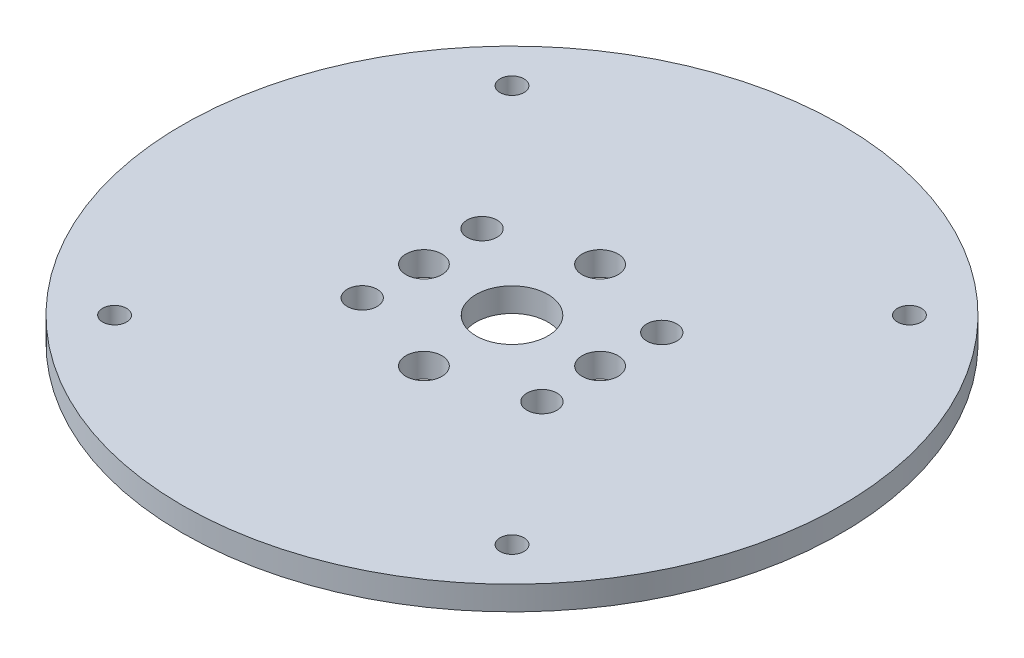
ISO-10303-21;
HEADER;
FILE_DESCRIPTION(('STEP AP214'),'2;1');
FILE_NAME('part.step','',(''),(''),'','','');
FILE_SCHEMA(('AUTOMOTIVE_DESIGN { 1 0 10303 214 1 1 1 1 }'));
ENDSEC;
DATA;
#1=APPLICATION_CONTEXT('core data for automotive mechanical design processes');
#2=APPLICATION_PROTOCOL_DEFINITION('international standard','automotive_design',2000,#1);
#3=PRODUCT_CONTEXT('',#1,'mechanical');
#4=PRODUCT('Part','Part','',(#3));
#5=PRODUCT_RELATED_PRODUCT_CATEGORY('part','',(#4));
#6=PRODUCT_DEFINITION_FORMATION('','',#4);
#7=PRODUCT_DEFINITION_CONTEXT('part definition',#1,'design');
#8=PRODUCT_DEFINITION('design','',#6,#7);
#9=PRODUCT_DEFINITION_SHAPE('','',#8);
#10=(LENGTH_UNIT() NAMED_UNIT(*) SI_UNIT(.MILLI.,.METRE.));
#11=(NAMED_UNIT(*) PLANE_ANGLE_UNIT() SI_UNIT($,.RADIAN.));
#12=(NAMED_UNIT(*) SI_UNIT($,.STERADIAN.) SOLID_ANGLE_UNIT());
#13=UNCERTAINTY_MEASURE_WITH_UNIT(LENGTH_MEASURE(1.E-05),#10,'distance_accuracy_value','');
#14=(GEOMETRIC_REPRESENTATION_CONTEXT(3) GLOBAL_UNCERTAINTY_ASSIGNED_CONTEXT((#13)) GLOBAL_UNIT_ASSIGNED_CONTEXT((#10,
#11,#12)) REPRESENTATION_CONTEXT('',''));
#15=CARTESIAN_POINT('',(0.,0.,0.));
#16=DIRECTION('',(0.,0.,1.));
#17=DIRECTION('',(1.,0.,0.));
#18=AXIS2_PLACEMENT_3D('',#15,#16,#17);
#19=CARTESIAN_POINT('',(1.14843970519052,2.,-1.09285714285713));
#20=DIRECTION('',(0.,1.,0.));
#21=DIRECTION('',(0.,0.,1.));
#22=AXIS2_PLACEMENT_3D('',#19,#20,#21);
#23=PLANE('',#22);
#24=CARTESIAN_POINT('',(17.7299397051905,2.,15.4886428571429));
#25=DIRECTION('',(0.,1.,0.));
#26=DIRECTION('',(0.,0.,1.));
#27=AXIS2_PLACEMENT_3D('',#24,#25,#26);
#28=CIRCLE('',#27,1.);
#29=CARTESIAN_POINT('',(17.7299397051905,2.,16.4886428571429));
#30=VERTEX_POINT('',#29);
#31=EDGE_CURVE('E106',#30,#30,#28,.T.);
#32=ORIENTED_EDGE('',*,*,#31,.F.);
#33=EDGE_LOOP('',(#32));
#34=FACE_BOUND('',#33,.T.);
#35=CARTESIAN_POINT('',(-15.4330602948095,2.,-17.6743571428571));
#36=DIRECTION('',(0.,1.,0.));
#37=DIRECTION('',(0.,0.,1.));
#38=AXIS2_PLACEMENT_3D('',#35,#36,#37);
#39=CIRCLE('',#38,1.);
#40=CARTESIAN_POINT('',(-15.4330602948095,2.,-16.6743571428571));
#41=VERTEX_POINT('',#40);
#42=EDGE_CURVE('E94',#41,#41,#39,.T.);
#43=ORIENTED_EDGE('',*,*,#42,.F.);
#44=EDGE_LOOP('',(#43));
#45=FACE_BOUND('',#44,.T.);
#46=CARTESIAN_POINT('',(8.64843970519052,2.,3.90714285714287));
#47=DIRECTION('',(0.,1.,0.));
#48=DIRECTION('',(0.,0.,1.));
#49=AXIS2_PLACEMENT_3D('',#46,#47,#48);
#50=CIRCLE('',#49,1.25);
#51=CARTESIAN_POINT('',(8.64843970519052,2.,5.15714285714287));
#52=VERTEX_POINT('',#51);
#53=EDGE_CURVE('E82',#52,#52,#50,.T.);
#54=ORIENTED_EDGE('',*,*,#53,.F.);
#55=EDGE_LOOP('',(#54));
#56=FACE_BOUND('',#55,.T.);
#57=CARTESIAN_POINT('',(-6.35156029480948,2.,-6.09285714285713));
#58=DIRECTION('',(0.,1.,0.));
#59=DIRECTION('',(0.,0.,1.));
#60=AXIS2_PLACEMENT_3D('',#57,#58,#59);
#61=CIRCLE('',#60,1.25);
#62=CARTESIAN_POINT('',(-6.35156029480948,2.,-4.84285714285713));
#63=VERTEX_POINT('',#62);
#64=EDGE_CURVE('E70',#63,#63,#61,.T.);
#65=ORIENTED_EDGE('',*,*,#64,.F.);
#66=EDGE_LOOP('',(#65));
#67=FACE_BOUND('',#66,.T.);
#68=CARTESIAN_POINT('',(8.49843970519052,2.,-1.09285714285708));
#69=DIRECTION('',(0.,1.,0.));
#70=DIRECTION('',(0.,0.,1.));
#71=AXIS2_PLACEMENT_3D('',#68,#69,#70);
#72=CIRCLE('',#71,1.5);
#73=CARTESIAN_POINT('',(8.49843970519052,2.,0.407142857142919));
#74=VERTEX_POINT('',#73);
#75=EDGE_CURVE('E58',#74,#74,#72,.T.);
#76=ORIENTED_EDGE('',*,*,#75,.F.);
#77=EDGE_LOOP('',(#76));
#78=FACE_BOUND('',#77,.T.);
#79=CARTESIAN_POINT('',(-6.20156029480948,2.,-1.09285714285713));
#80=DIRECTION('',(0.,1.,0.));
#81=DIRECTION('',(0.,0.,1.));
#82=AXIS2_PLACEMENT_3D('',#79,#80,#81);
#83=CIRCLE('',#82,1.5);
#84=CARTESIAN_POINT('',(-6.20156029480948,2.,0.407142857142868));
#85=VERTEX_POINT('',#84);
#86=EDGE_CURVE('E46',#85,#85,#83,.T.);
#87=ORIENTED_EDGE('',*,*,#86,.F.);
#88=EDGE_LOOP('',(#87));
#89=FACE_BOUND('',#88,.T.);
#90=CARTESIAN_POINT('',(1.14843970519052,2.,-1.09285714285713));
#91=DIRECTION('',(0.,1.,0.));
#92=DIRECTION('',(0.,0.,1.));
#93=AXIS2_PLACEMENT_3D('',#90,#91,#92);
#94=CIRCLE('',#93,27.5);
#95=CARTESIAN_POINT('',(1.14843970519052,2.,26.4071428571429));
#96=VERTEX_POINT('',#95);
#97=EDGE_CURVE('E10',#96,#96,#94,.T.);
#98=ORIENTED_EDGE('',*,*,#97,.T.);
#99=EDGE_LOOP('',(#98));
#100=FACE_BOUND('',#99,.T.);
#101=CARTESIAN_POINT('',(1.14843970519052,2.,-1.09285714285713));
#102=DIRECTION('',(0.,1.,0.));
#103=DIRECTION('',(0.,0.,1.));
#104=AXIS2_PLACEMENT_3D('',#101,#102,#103);
#105=CIRCLE('',#104,3.);
#106=CARTESIAN_POINT('',(1.14843970519052,2.,1.90714285714287));
#107=VERTEX_POINT('',#106);
#108=EDGE_CURVE('E41',#107,#107,#105,.T.);
#109=ORIENTED_EDGE('',*,*,#108,.F.);
#110=EDGE_LOOP('',(#109));
#111=FACE_BOUND('',#110,.T.);
#112=CARTESIAN_POINT('',(1.14843970519054,2.,-8.44285714285713));
#113=DIRECTION('',(0.,1.,0.));
#114=DIRECTION('',(0.,0.,1.));
#115=AXIS2_PLACEMENT_3D('',#112,#113,#114);
#116=CIRCLE('',#115,1.5);
#117=CARTESIAN_POINT('',(1.14843970519054,2.,-6.94285714285713));
#118=VERTEX_POINT('',#117);
#119=EDGE_CURVE('E52',#118,#118,#116,.T.);
#120=ORIENTED_EDGE('',*,*,#119,.F.);
#121=EDGE_LOOP('',(#120));
#122=FACE_BOUND('',#121,.T.);
#123=CARTESIAN_POINT('',(1.14843970519044,2.,6.25714285714287));
#124=DIRECTION('',(0.,1.,0.));
#125=DIRECTION('',(0.,0.,1.));
#126=AXIS2_PLACEMENT_3D('',#123,#124,#125);
#127=CIRCLE('',#126,1.5);
#128=CARTESIAN_POINT('',(1.14843970519044,2.,7.75714285714287));
#129=VERTEX_POINT('',#128);
#130=EDGE_CURVE('E64',#129,#129,#127,.T.);
#131=ORIENTED_EDGE('',*,*,#130,.F.);
#132=EDGE_LOOP('',(#131));
#133=FACE_BOUND('',#132,.T.);
#134=CARTESIAN_POINT('',(8.64843970519052,2.,-6.09285714285713));
#135=DIRECTION('',(0.,1.,0.));
#136=DIRECTION('',(0.,0.,1.));
#137=AXIS2_PLACEMENT_3D('',#134,#135,#136);
#138=CIRCLE('',#137,1.25);
#139=CARTESIAN_POINT('',(8.64843970519052,2.,-4.84285714285713));
#140=VERTEX_POINT('',#139);
#141=EDGE_CURVE('E76',#140,#140,#138,.T.);
#142=ORIENTED_EDGE('',*,*,#141,.F.);
#143=EDGE_LOOP('',(#142));
#144=FACE_BOUND('',#143,.T.);
#145=CARTESIAN_POINT('',(-6.35156029480948,2.,3.90714285714287));
#146=DIRECTION('',(0.,1.,0.));
#147=DIRECTION('',(0.,0.,1.));
#148=AXIS2_PLACEMENT_3D('',#145,#146,#147);
#149=CIRCLE('',#148,1.25);
#150=CARTESIAN_POINT('',(-6.35156029480948,2.,5.15714285714287));
#151=VERTEX_POINT('',#150);
#152=EDGE_CURVE('E88',#151,#151,#149,.T.);
#153=ORIENTED_EDGE('',*,*,#152,.F.);
#154=EDGE_LOOP('',(#153));
#155=FACE_BOUND('',#154,.T.);
#156=CARTESIAN_POINT('',(17.7299397051905,2.,-17.6743571428571));
#157=DIRECTION('',(0.,1.,0.));
#158=DIRECTION('',(0.,0.,1.));
#159=AXIS2_PLACEMENT_3D('',#156,#157,#158);
#160=CIRCLE('',#159,1.);
#161=CARTESIAN_POINT('',(17.7299397051905,2.,-16.6743571428571));
#162=VERTEX_POINT('',#161);
#163=EDGE_CURVE('E100',#162,#162,#160,.T.);
#164=ORIENTED_EDGE('',*,*,#163,.F.);
#165=EDGE_LOOP('',(#164));
#166=FACE_BOUND('',#165,.T.);
#167=CARTESIAN_POINT('',(-15.4330602948095,2.,15.4886428571429));
#168=DIRECTION('',(0.,1.,0.));
#169=DIRECTION('',(0.,0.,1.));
#170=AXIS2_PLACEMENT_3D('',#167,#168,#169);
#171=CIRCLE('',#170,1.);
#172=CARTESIAN_POINT('',(-15.4330602948095,2.,16.4886428571429));
#173=VERTEX_POINT('',#172);
#174=EDGE_CURVE('E112',#173,#173,#171,.T.);
#175=ORIENTED_EDGE('',*,*,#174,.F.);
#176=EDGE_LOOP('',(#175));
#177=FACE_BOUND('',#176,.T.);
#178=ADVANCED_FACE('F30',(#34,#45,#56,#67,#78,#89,#100,#111,#122,#133,#144,#155,#166,#177),#23,.T.);
#179=CARTESIAN_POINT('',(1.14843970519052,0.,-1.09285714285713));
#180=DIRECTION('',(0.,1.,0.));
#181=DIRECTION('',(0.,0.,1.));
#182=AXIS2_PLACEMENT_3D('',#179,#180,#181);
#183=PLANE('',#182);
#184=CARTESIAN_POINT('',(1.14843970519052,0.,-1.09285714285713));
#185=DIRECTION('',(0.,1.,0.));
#186=DIRECTION('',(0.,0.,1.));
#187=AXIS2_PLACEMENT_3D('',#184,#185,#186);
#188=CIRCLE('',#187,27.5);
#189=CARTESIAN_POINT('',(1.14843970519052,0.,26.4071428571429));
#190=VERTEX_POINT('',#189);
#191=EDGE_CURVE('E34',#190,#190,#188,.T.);
#192=ORIENTED_EDGE('',*,*,#191,.F.);
#193=EDGE_LOOP('',(#192));
#194=FACE_BOUND('',#193,.T.);
#195=CARTESIAN_POINT('',(1.14843970519052,0.,-1.09285714285713));
#196=DIRECTION('',(0.,1.,0.));
#197=DIRECTION('',(0.,0.,1.));
#198=AXIS2_PLACEMENT_3D('',#195,#196,#197);
#199=CIRCLE('',#198,3.);
#200=CARTESIAN_POINT('',(1.14843970519052,0.,1.90714285714287));
#201=VERTEX_POINT('',#200);
#202=EDGE_CURVE('E43',#201,#201,#199,.T.);
#203=ORIENTED_EDGE('',*,*,#202,.T.);
#204=EDGE_LOOP('',(#203));
#205=FACE_BOUND('',#204,.T.);
#206=CARTESIAN_POINT('',(-6.20156029480948,0.,-1.09285714285713));
#207=DIRECTION('',(0.,1.,0.));
#208=DIRECTION('',(0.,0.,1.));
#209=AXIS2_PLACEMENT_3D('',#206,#207,#208);
#210=CIRCLE('',#209,1.5);
#211=CARTESIAN_POINT('',(-6.20156029480948,0.,0.407142857142868));
#212=VERTEX_POINT('',#211);
#213=EDGE_CURVE('E49',#212,#212,#210,.T.);
#214=ORIENTED_EDGE('',*,*,#213,.T.);
#215=EDGE_LOOP('',(#214));
#216=FACE_BOUND('',#215,.T.);
#217=CARTESIAN_POINT('',(1.14843970519054,0.,-8.44285714285713));
#218=DIRECTION('',(0.,1.,0.));
#219=DIRECTION('',(0.,0.,1.));
#220=AXIS2_PLACEMENT_3D('',#217,#218,#219);
#221=CIRCLE('',#220,1.5);
#222=CARTESIAN_POINT('',(1.14843970519054,0.,-6.94285714285713));
#223=VERTEX_POINT('',#222);
#224=EDGE_CURVE('E55',#223,#223,#221,.T.);
#225=ORIENTED_EDGE('',*,*,#224,.T.);
#226=EDGE_LOOP('',(#225));
#227=FACE_BOUND('',#226,.T.);
#228=CARTESIAN_POINT('',(8.49843970519052,0.,-1.09285714285708));
#229=DIRECTION('',(0.,1.,0.));
#230=DIRECTION('',(0.,0.,1.));
#231=AXIS2_PLACEMENT_3D('',#228,#229,#230);
#232=CIRCLE('',#231,1.5);
#233=CARTESIAN_POINT('',(8.49843970519052,0.,0.407142857142919));
#234=VERTEX_POINT('',#233);
#235=EDGE_CURVE('E61',#234,#234,#232,.T.);
#236=ORIENTED_EDGE('',*,*,#235,.T.);
#237=EDGE_LOOP('',(#236));
#238=FACE_BOUND('',#237,.T.);
#239=CARTESIAN_POINT('',(1.14843970519044,0.,6.25714285714287));
#240=DIRECTION('',(0.,1.,0.));
#241=DIRECTION('',(0.,0.,1.));
#242=AXIS2_PLACEMENT_3D('',#239,#240,#241);
#243=CIRCLE('',#242,1.5);
#244=CARTESIAN_POINT('',(1.14843970519044,0.,7.75714285714287));
#245=VERTEX_POINT('',#244);
#246=EDGE_CURVE('E67',#245,#245,#243,.T.);
#247=ORIENTED_EDGE('',*,*,#246,.T.);
#248=EDGE_LOOP('',(#247));
#249=FACE_BOUND('',#248,.T.);
#250=CARTESIAN_POINT('',(-6.35156029480948,0.,-6.09285714285713));
#251=DIRECTION('',(0.,1.,0.));
#252=DIRECTION('',(0.,0.,1.));
#253=AXIS2_PLACEMENT_3D('',#250,#251,#252);
#254=CIRCLE('',#253,1.25);
#255=CARTESIAN_POINT('',(-6.35156029480948,0.,-4.84285714285713));
#256=VERTEX_POINT('',#255);
#257=EDGE_CURVE('E73',#256,#256,#254,.T.);
#258=ORIENTED_EDGE('',*,*,#257,.T.);
#259=EDGE_LOOP('',(#258));
#260=FACE_BOUND('',#259,.T.);
#261=CARTESIAN_POINT('',(8.64843970519052,0.,-6.09285714285713));
#262=DIRECTION('',(0.,1.,0.));
#263=DIRECTION('',(0.,0.,1.));
#264=AXIS2_PLACEMENT_3D('',#261,#262,#263);
#265=CIRCLE('',#264,1.25);
#266=CARTESIAN_POINT('',(8.64843970519052,0.,-4.84285714285713));
#267=VERTEX_POINT('',#266);
#268=EDGE_CURVE('E79',#267,#267,#265,.T.);
#269=ORIENTED_EDGE('',*,*,#268,.T.);
#270=EDGE_LOOP('',(#269));
#271=FACE_BOUND('',#270,.T.);
#272=CARTESIAN_POINT('',(8.64843970519052,0.,3.90714285714287));
#273=DIRECTION('',(0.,1.,0.));
#274=DIRECTION('',(0.,0.,1.));
#275=AXIS2_PLACEMENT_3D('',#272,#273,#274);
#276=CIRCLE('',#275,1.25);
#277=CARTESIAN_POINT('',(8.64843970519052,0.,5.15714285714287));
#278=VERTEX_POINT('',#277);
#279=EDGE_CURVE('E85',#278,#278,#276,.T.);
#280=ORIENTED_EDGE('',*,*,#279,.T.);
#281=EDGE_LOOP('',(#280));
#282=FACE_BOUND('',#281,.T.);
#283=CARTESIAN_POINT('',(-6.35156029480948,0.,3.90714285714287));
#284=DIRECTION('',(0.,1.,0.));
#285=DIRECTION('',(0.,0.,1.));
#286=AXIS2_PLACEMENT_3D('',#283,#284,#285);
#287=CIRCLE('',#286,1.25);
#288=CARTESIAN_POINT('',(-6.35156029480948,0.,5.15714285714287));
#289=VERTEX_POINT('',#288);
#290=EDGE_CURVE('E91',#289,#289,#287,.T.);
#291=ORIENTED_EDGE('',*,*,#290,.T.);
#292=EDGE_LOOP('',(#291));
#293=FACE_BOUND('',#292,.T.);
#294=CARTESIAN_POINT('',(-15.4330602948095,0.,-17.6743571428571));
#295=DIRECTION('',(0.,1.,0.));
#296=DIRECTION('',(0.,0.,1.));
#297=AXIS2_PLACEMENT_3D('',#294,#295,#296);
#298=CIRCLE('',#297,1.);
#299=CARTESIAN_POINT('',(-15.4330602948095,0.,-16.6743571428571));
#300=VERTEX_POINT('',#299);
#301=EDGE_CURVE('E97',#300,#300,#298,.T.);
#302=ORIENTED_EDGE('',*,*,#301,.T.);
#303=EDGE_LOOP('',(#302));
#304=FACE_BOUND('',#303,.T.);
#305=CARTESIAN_POINT('',(17.7299397051905,0.,-17.6743571428571));
#306=DIRECTION('',(0.,1.,0.));
#307=DIRECTION('',(0.,0.,1.));
#308=AXIS2_PLACEMENT_3D('',#305,#306,#307);
#309=CIRCLE('',#308,1.);
#310=CARTESIAN_POINT('',(17.7299397051905,0.,-16.6743571428571));
#311=VERTEX_POINT('',#310);
#312=EDGE_CURVE('E103',#311,#311,#309,.T.);
#313=ORIENTED_EDGE('',*,*,#312,.T.);
#314=EDGE_LOOP('',(#313));
#315=FACE_BOUND('',#314,.T.);
#316=CARTESIAN_POINT('',(17.7299397051905,0.,15.4886428571429));
#317=DIRECTION('',(0.,1.,0.));
#318=DIRECTION('',(0.,0.,1.));
#319=AXIS2_PLACEMENT_3D('',#316,#317,#318);
#320=CIRCLE('',#319,1.);
#321=CARTESIAN_POINT('',(17.7299397051905,0.,16.4886428571429));
#322=VERTEX_POINT('',#321);
#323=EDGE_CURVE('E109',#322,#322,#320,.T.);
#324=ORIENTED_EDGE('',*,*,#323,.T.);
#325=EDGE_LOOP('',(#324));
#326=FACE_BOUND('',#325,.T.);
#327=CARTESIAN_POINT('',(-15.4330602948095,0.,15.4886428571429));
#328=DIRECTION('',(0.,1.,0.));
#329=DIRECTION('',(0.,0.,1.));
#330=AXIS2_PLACEMENT_3D('',#327,#328,#329);
#331=CIRCLE('',#330,1.);
#332=CARTESIAN_POINT('',(-15.4330602948095,0.,16.4886428571429));
#333=VERTEX_POINT('',#332);
#334=EDGE_CURVE('E115',#333,#333,#331,.T.);
#335=ORIENTED_EDGE('',*,*,#334,.T.);
#336=EDGE_LOOP('',(#335));
#337=FACE_BOUND('',#336,.T.);
#338=ADVANCED_FACE('F125',(#194,#205,#216,#227,#238,#249,#260,#271,#282,#293,#304,#315,#326,
#337),#183,.F.);
#339=CARTESIAN_POINT('',(1.14843970519052,2.,-1.09285714285713));
#340=DIRECTION('',(0.,-1.,0.));
#341=DIRECTION('',(0.,0.,-1.));
#342=AXIS2_PLACEMENT_3D('',#339,#340,#341);
#343=CYLINDRICAL_SURFACE('',#342,27.5);
#344=ORIENTED_EDGE('',*,*,#97,.F.);
#345=EDGE_LOOP('',(#344));
#346=FACE_BOUND('',#345,.T.);
#347=ORIENTED_EDGE('',*,*,#191,.T.);
#348=EDGE_LOOP('',(#347));
#349=FACE_BOUND('',#348,.T.);
#350=ADVANCED_FACE('F32',(#346,#349),#343,.T.);
#351=CARTESIAN_POINT('',(1.14843970519052,2.,-1.09285714285713));
#352=DIRECTION('',(0.,-1.,0.));
#353=DIRECTION('',(0.,0.,-1.));
#354=AXIS2_PLACEMENT_3D('',#351,#352,#353);
#355=CYLINDRICAL_SURFACE('',#354,3.);
#356=ORIENTED_EDGE('',*,*,#108,.T.);
#357=EDGE_LOOP('',(#356));
#358=FACE_BOUND('',#357,.T.);
#359=ORIENTED_EDGE('',*,*,#202,.F.);
#360=EDGE_LOOP('',(#359));
#361=FACE_BOUND('',#360,.T.);
#362=ADVANCED_FACE('F135',(#358,#361),#355,.F.);
#363=CARTESIAN_POINT('',(-6.20156029480948,2.,-1.09285714285713));
#364=DIRECTION('',(0.,-1.,0.));
#365=DIRECTION('',(0.,0.,-1.));
#366=AXIS2_PLACEMENT_3D('',#363,#364,#365);
#367=CYLINDRICAL_SURFACE('',#366,1.5);
#368=ORIENTED_EDGE('',*,*,#86,.T.);
#369=EDGE_LOOP('',(#368));
#370=FACE_BOUND('',#369,.T.);
#371=ORIENTED_EDGE('',*,*,#213,.F.);
#372=EDGE_LOOP('',(#371));
#373=FACE_BOUND('',#372,.T.);
#374=ADVANCED_FACE('F138',(#370,#373),#367,.F.);
#375=CARTESIAN_POINT('',(1.14843970519054,2.,-8.44285714285713));
#376=DIRECTION('',(0.,-1.,0.));
#377=DIRECTION('',(0.,0.,-1.));
#378=AXIS2_PLACEMENT_3D('',#375,#376,#377);
#379=CYLINDRICAL_SURFACE('',#378,1.5);
#380=ORIENTED_EDGE('',*,*,#119,.T.);
#381=EDGE_LOOP('',(#380));
#382=FACE_BOUND('',#381,.T.);
#383=ORIENTED_EDGE('',*,*,#224,.F.);
#384=EDGE_LOOP('',(#383));
#385=FACE_BOUND('',#384,.T.);
#386=ADVANCED_FACE('F142',(#382,#385),#379,.F.);
#387=CARTESIAN_POINT('',(8.49843970519052,2.,-1.09285714285708));
#388=DIRECTION('',(0.,-1.,0.));
#389=DIRECTION('',(0.,0.,-1.));
#390=AXIS2_PLACEMENT_3D('',#387,#388,#389);
#391=CYLINDRICAL_SURFACE('',#390,1.5);
#392=ORIENTED_EDGE('',*,*,#75,.T.);
#393=EDGE_LOOP('',(#392));
#394=FACE_BOUND('',#393,.T.);
#395=ORIENTED_EDGE('',*,*,#235,.F.);
#396=EDGE_LOOP('',(#395));
#397=FACE_BOUND('',#396,.T.);
#398=ADVANCED_FACE('F146',(#394,#397),#391,.F.);
#399=CARTESIAN_POINT('',(1.14843970519044,2.,6.25714285714287));
#400=DIRECTION('',(0.,-1.,0.));
#401=DIRECTION('',(0.,0.,-1.));
#402=AXIS2_PLACEMENT_3D('',#399,#400,#401);
#403=CYLINDRICAL_SURFACE('',#402,1.5);
#404=ORIENTED_EDGE('',*,*,#130,.T.);
#405=EDGE_LOOP('',(#404));
#406=FACE_BOUND('',#405,.T.);
#407=ORIENTED_EDGE('',*,*,#246,.F.);
#408=EDGE_LOOP('',(#407));
#409=FACE_BOUND('',#408,.T.);
#410=ADVANCED_FACE('F150',(#406,#409),#403,.F.);
#411=CARTESIAN_POINT('',(-6.35156029480948,2.,-6.09285714285713));
#412=DIRECTION('',(0.,-1.,0.));
#413=DIRECTION('',(0.,0.,-1.));
#414=AXIS2_PLACEMENT_3D('',#411,#412,#413);
#415=CYLINDRICAL_SURFACE('',#414,1.25);
#416=ORIENTED_EDGE('',*,*,#64,.T.);
#417=EDGE_LOOP('',(#416));
#418=FACE_BOUND('',#417,.T.);
#419=ORIENTED_EDGE('',*,*,#257,.F.);
#420=EDGE_LOOP('',(#419));
#421=FACE_BOUND('',#420,.T.);
#422=ADVANCED_FACE('F154',(#418,#421),#415,.F.);
#423=CARTESIAN_POINT('',(8.64843970519052,2.,-6.09285714285713));
#424=DIRECTION('',(0.,-1.,0.));
#425=DIRECTION('',(0.,0.,-1.));
#426=AXIS2_PLACEMENT_3D('',#423,#424,#425);
#427=CYLINDRICAL_SURFACE('',#426,1.25);
#428=ORIENTED_EDGE('',*,*,#141,.T.);
#429=EDGE_LOOP('',(#428));
#430=FACE_BOUND('',#429,.T.);
#431=ORIENTED_EDGE('',*,*,#268,.F.);
#432=EDGE_LOOP('',(#431));
#433=FACE_BOUND('',#432,.T.);
#434=ADVANCED_FACE('F158',(#430,#433),#427,.F.);
#435=CARTESIAN_POINT('',(8.64843970519052,2.,3.90714285714287));
#436=DIRECTION('',(0.,-1.,0.));
#437=DIRECTION('',(0.,0.,-1.));
#438=AXIS2_PLACEMENT_3D('',#435,#436,#437);
#439=CYLINDRICAL_SURFACE('',#438,1.25);
#440=ORIENTED_EDGE('',*,*,#53,.T.);
#441=EDGE_LOOP('',(#440));
#442=FACE_BOUND('',#441,.T.);
#443=ORIENTED_EDGE('',*,*,#279,.F.);
#444=EDGE_LOOP('',(#443));
#445=FACE_BOUND('',#444,.T.);
#446=ADVANCED_FACE('F162',(#442,#445),#439,.F.);
#447=CARTESIAN_POINT('',(-6.35156029480948,2.,3.90714285714287));
#448=DIRECTION('',(0.,-1.,0.));
#449=DIRECTION('',(0.,0.,-1.));
#450=AXIS2_PLACEMENT_3D('',#447,#448,#449);
#451=CYLINDRICAL_SURFACE('',#450,1.25);
#452=ORIENTED_EDGE('',*,*,#152,.T.);
#453=EDGE_LOOP('',(#452));
#454=FACE_BOUND('',#453,.T.);
#455=ORIENTED_EDGE('',*,*,#290,.F.);
#456=EDGE_LOOP('',(#455));
#457=FACE_BOUND('',#456,.T.);
#458=ADVANCED_FACE('F166',(#454,#457),#451,.F.);
#459=CARTESIAN_POINT('',(-15.4330602948095,2.,-17.6743571428571));
#460=DIRECTION('',(0.,-1.,0.));
#461=DIRECTION('',(0.,0.,-1.));
#462=AXIS2_PLACEMENT_3D('',#459,#460,#461);
#463=CYLINDRICAL_SURFACE('',#462,1.);
#464=ORIENTED_EDGE('',*,*,#42,.T.);
#465=EDGE_LOOP('',(#464));
#466=FACE_BOUND('',#465,.T.);
#467=ORIENTED_EDGE('',*,*,#301,.F.);
#468=EDGE_LOOP('',(#467));
#469=FACE_BOUND('',#468,.T.);
#470=ADVANCED_FACE('F170',(#466,#469),#463,.F.);
#471=CARTESIAN_POINT('',(17.7299397051905,2.,-17.6743571428571));
#472=DIRECTION('',(0.,-1.,0.));
#473=DIRECTION('',(0.,0.,-1.));
#474=AXIS2_PLACEMENT_3D('',#471,#472,#473);
#475=CYLINDRICAL_SURFACE('',#474,1.);
#476=ORIENTED_EDGE('',*,*,#163,.T.);
#477=EDGE_LOOP('',(#476));
#478=FACE_BOUND('',#477,.T.);
#479=ORIENTED_EDGE('',*,*,#312,.F.);
#480=EDGE_LOOP('',(#479));
#481=FACE_BOUND('',#480,.T.);
#482=ADVANCED_FACE('F174',(#478,#481),#475,.F.);
#483=CARTESIAN_POINT('',(17.7299397051905,2.,15.4886428571429));
#484=DIRECTION('',(0.,-1.,0.));
#485=DIRECTION('',(0.,0.,-1.));
#486=AXIS2_PLACEMENT_3D('',#483,#484,#485);
#487=CYLINDRICAL_SURFACE('',#486,1.);
#488=ORIENTED_EDGE('',*,*,#31,.T.);
#489=EDGE_LOOP('',(#488));
#490=FACE_BOUND('',#489,.T.);
#491=ORIENTED_EDGE('',*,*,#323,.F.);
#492=EDGE_LOOP('',(#491));
#493=FACE_BOUND('',#492,.T.);
#494=ADVANCED_FACE('F178',(#490,#493),#487,.F.);
#495=CARTESIAN_POINT('',(-15.4330602948095,2.,15.4886428571429));
#496=DIRECTION('',(0.,-1.,0.));
#497=DIRECTION('',(0.,0.,-1.));
#498=AXIS2_PLACEMENT_3D('',#495,#496,#497);
#499=CYLINDRICAL_SURFACE('',#498,1.);
#500=ORIENTED_EDGE('',*,*,#174,.T.);
#501=EDGE_LOOP('',(#500));
#502=FACE_BOUND('',#501,.T.);
#503=ORIENTED_EDGE('',*,*,#334,.F.);
#504=EDGE_LOOP('',(#503));
#505=FACE_BOUND('',#504,.T.);
#506=ADVANCED_FACE('F121',(#502,#505),#499,.F.);
#507=CLOSED_SHELL('',(#178,#338,#350,#362,#374,#386,#398,#410,#422,#434,#446,#458,#470,#482,
#494,#506));
#508=MANIFOLD_SOLID_BREP('B2',#507);
#509=ADVANCED_BREP_SHAPE_REPRESENTATION('',(#18,#508),#14);
#510=SHAPE_DEFINITION_REPRESENTATION(#9,#509);
ENDSEC;
END-ISO-10303-21;
